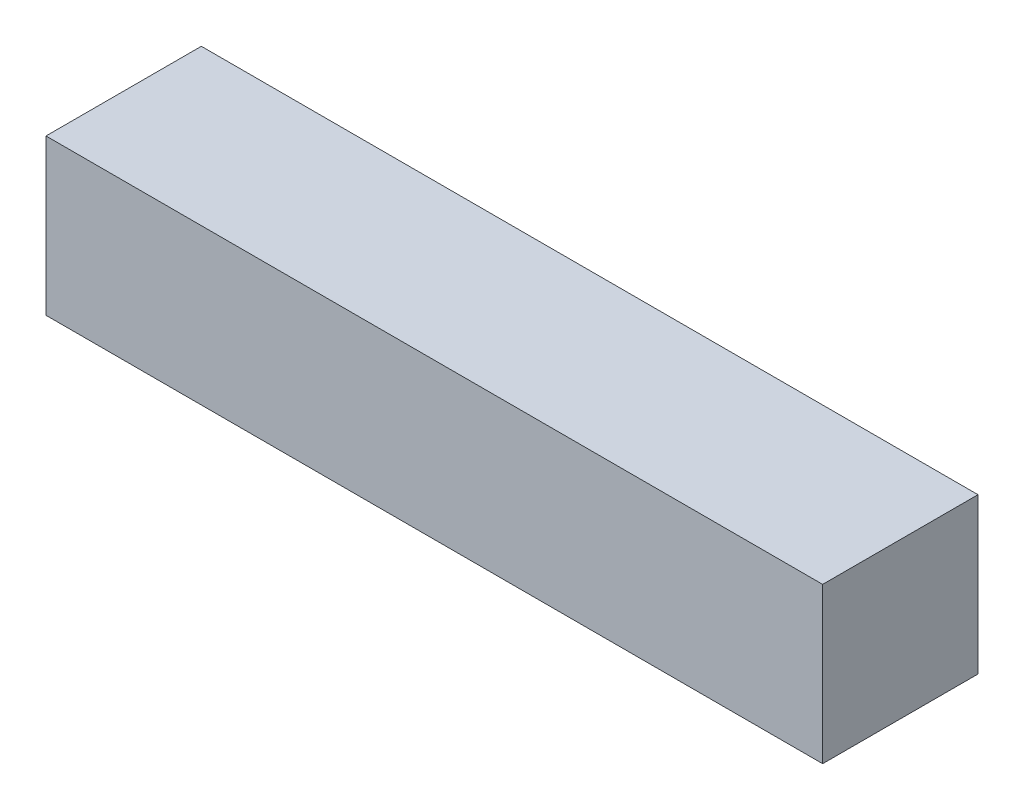
ISO-10303-21;
HEADER;
FILE_DESCRIPTION(('STEP AP214'),'2;1');
FILE_NAME('part.step','',(''),(''),'','','');
FILE_SCHEMA(('AUTOMOTIVE_DESIGN { 1 0 10303 214 1 1 1 1 }'));
ENDSEC;
DATA;
#1=APPLICATION_CONTEXT('core data for automotive mechanical design processes');
#2=APPLICATION_PROTOCOL_DEFINITION('international standard','automotive_design',2000,#1);
#3=PRODUCT_CONTEXT('',#1,'mechanical');
#4=PRODUCT('Part','Part','',(#3));
#5=PRODUCT_RELATED_PRODUCT_CATEGORY('part','',(#4));
#6=PRODUCT_DEFINITION_FORMATION('','',#4);
#7=PRODUCT_DEFINITION_CONTEXT('part definition',#1,'design');
#8=PRODUCT_DEFINITION('design','',#6,#7);
#9=PRODUCT_DEFINITION_SHAPE('','',#8);
#10=(LENGTH_UNIT() NAMED_UNIT(*) SI_UNIT(.MILLI.,.METRE.));
#11=(NAMED_UNIT(*) PLANE_ANGLE_UNIT() SI_UNIT($,.RADIAN.));
#12=(NAMED_UNIT(*) SI_UNIT($,.STERADIAN.) SOLID_ANGLE_UNIT());
#13=UNCERTAINTY_MEASURE_WITH_UNIT(LENGTH_MEASURE(1.E-05),#10,'distance_accuracy_value','');
#14=(GEOMETRIC_REPRESENTATION_CONTEXT(3) GLOBAL_UNCERTAINTY_ASSIGNED_CONTEXT((#13)) GLOBAL_UNIT_ASSIGNED_CONTEXT((#10,
#11,#12)) REPRESENTATION_CONTEXT('',''));
#15=CARTESIAN_POINT('',(0.,0.,0.));
#16=DIRECTION('',(0.,0.,1.));
#17=DIRECTION('',(1.,0.,0.));
#18=AXIS2_PLACEMENT_3D('',#15,#16,#17);
#19=CARTESIAN_POINT('',(-18.0731707317074,-6.,6.));
#20=DIRECTION('',(0.,1.,0.));
#21=DIRECTION('',(-1.,0.,0.));
#22=AXIS2_PLACEMENT_3D('',#19,#20,#21);
#23=PLANE('',#22);
#24=DIRECTION('',(1.,0.,0.));
#25=VECTOR('',#24,1.);
#26=CARTESIAN_POINT('',(-18.0731707317074,-6.,0.));
#27=LINE('',#26,#25);
#28=CARTESIAN_POINT('',(-18.0731707317074,-6.,0.));
#29=VERTEX_POINT('',#28);
#30=CARTESIAN_POINT('',(11.9268292682926,-6.,0.));
#31=VERTEX_POINT('',#30);
#32=EDGE_CURVE('E104',#29,#31,#27,.T.);
#33=ORIENTED_EDGE('',*,*,#32,.T.);
#34=DIRECTION('',(0.,0.,-1.));
#35=VECTOR('',#34,1.);
#36=CARTESIAN_POINT('',(11.9268292682926,-6.,6.));
#37=LINE('',#36,#35);
#38=CARTESIAN_POINT('',(11.9268292682926,-6.,6.));
#39=VERTEX_POINT('',#38);
#40=EDGE_CURVE('E11',#39,#31,#37,.T.);
#41=ORIENTED_EDGE('',*,*,#40,.F.);
#42=DIRECTION('',(1.,0.,0.));
#43=VECTOR('',#42,1.);
#44=CARTESIAN_POINT('',(-18.0731707317074,-6.,6.));
#45=LINE('',#44,#43);
#46=CARTESIAN_POINT('',(-18.0731707317074,-6.,6.));
#47=VERTEX_POINT('',#46);
#48=EDGE_CURVE('E92',#47,#39,#45,.T.);
#49=ORIENTED_EDGE('',*,*,#48,.F.);
#50=DIRECTION('',(0.,0.,-1.));
#51=VECTOR('',#50,1.);
#52=CARTESIAN_POINT('',(-18.0731707317074,-6.,6.));
#53=LINE('',#52,#51);
#54=EDGE_CURVE('E100',#47,#29,#53,.T.);
#55=ORIENTED_EDGE('',*,*,#54,.T.);
#56=EDGE_LOOP('',(#33,#41,#49,#55));
#57=FACE_BOUND('',#56,.T.);
#58=ADVANCED_FACE('F41',(#57),#23,.F.);
#59=CARTESIAN_POINT('',(11.9268292682926,-6.,6.));
#60=DIRECTION('',(-1.,0.,0.));
#61=DIRECTION('',(0.,0.,1.));
#62=AXIS2_PLACEMENT_3D('',#59,#60,#61);
#63=PLANE('',#62);
#64=DIRECTION('',(0.,1.,0.));
#65=VECTOR('',#64,1.);
#66=CARTESIAN_POINT('',(11.9268292682926,-6.,0.));
#67=LINE('',#66,#65);
#68=CARTESIAN_POINT('',(11.9268292682926,0.,0.));
#69=VERTEX_POINT('',#68);
#70=EDGE_CURVE('E96',#31,#69,#67,.T.);
#71=ORIENTED_EDGE('',*,*,#70,.T.);
#72=DIRECTION('',(0.,0.,-1.));
#73=VECTOR('',#72,1.);
#74=CARTESIAN_POINT('',(11.9268292682926,0.,6.));
#75=LINE('',#74,#73);
#76=CARTESIAN_POINT('',(11.9268292682926,0.,6.));
#77=VERTEX_POINT('',#76);
#78=EDGE_CURVE('E49',#77,#69,#75,.T.);
#79=ORIENTED_EDGE('',*,*,#78,.F.);
#80=DIRECTION('',(0.,1.,0.));
#81=VECTOR('',#80,1.);
#82=CARTESIAN_POINT('',(11.9268292682926,-6.,6.));
#83=LINE('',#82,#81);
#84=EDGE_CURVE('E87',#39,#77,#83,.T.);
#85=ORIENTED_EDGE('',*,*,#84,.F.);
#86=ORIENTED_EDGE('',*,*,#40,.T.);
#87=EDGE_LOOP('',(#71,#79,#85,#86));
#88=FACE_BOUND('',#87,.T.);
#89=ADVANCED_FACE('F95',(#88),#63,.F.);
#90=CARTESIAN_POINT('',(-18.0731707317074,0.,6.));
#91=DIRECTION('',(0.,-1.,0.));
#92=DIRECTION('',(1.,0.,0.));
#93=AXIS2_PLACEMENT_3D('',#90,#91,#92);
#94=PLANE('',#93);
#95=DIRECTION('',(-1.,0.,0.));
#96=VECTOR('',#95,1.);
#97=CARTESIAN_POINT('',(-18.0731707317074,0.,0.));
#98=LINE('',#97,#96);
#99=CARTESIAN_POINT('',(-18.0731707317074,0.,0.));
#100=VERTEX_POINT('',#99);
#101=EDGE_CURVE('E74',#69,#100,#98,.T.);
#102=ORIENTED_EDGE('',*,*,#101,.T.);
#103=DIRECTION('',(0.,0.,-1.));
#104=VECTOR('',#103,1.);
#105=CARTESIAN_POINT('',(-18.0731707317074,0.,6.));
#106=LINE('',#105,#104);
#107=CARTESIAN_POINT('',(-18.0731707317074,0.,6.));
#108=VERTEX_POINT('',#107);
#109=EDGE_CURVE('E97',#108,#100,#106,.T.);
#110=ORIENTED_EDGE('',*,*,#109,.F.);
#111=DIRECTION('',(-1.,0.,0.));
#112=VECTOR('',#111,1.);
#113=CARTESIAN_POINT('',(-18.0731707317074,0.,6.));
#114=LINE('',#113,#112);
#115=EDGE_CURVE('E90',#77,#108,#114,.T.);
#116=ORIENTED_EDGE('',*,*,#115,.F.);
#117=ORIENTED_EDGE('',*,*,#78,.T.);
#118=EDGE_LOOP('',(#102,#110,#116,#117));
#119=FACE_BOUND('',#118,.T.);
#120=ADVANCED_FACE('F98',(#119),#94,.F.);
#121=CARTESIAN_POINT('',(-18.0731707317074,-6.,6.));
#122=DIRECTION('',(1.,0.,0.));
#123=DIRECTION('',(0.,0.,-1.));
#124=AXIS2_PLACEMENT_3D('',#121,#122,#123);
#125=PLANE('',#124);
#126=DIRECTION('',(0.,-1.,0.));
#127=VECTOR('',#126,1.);
#128=CARTESIAN_POINT('',(-18.0731707317074,-6.,0.));
#129=LINE('',#128,#127);
#130=EDGE_CURVE('E80',#100,#29,#129,.T.);
#131=ORIENTED_EDGE('',*,*,#130,.T.);
#132=ORIENTED_EDGE('',*,*,#54,.F.);
#133=DIRECTION('',(0.,-1.,0.));
#134=VECTOR('',#133,1.);
#135=CARTESIAN_POINT('',(-18.0731707317074,-6.,6.));
#136=LINE('',#135,#134);
#137=EDGE_CURVE('E57',#108,#47,#136,.T.);
#138=ORIENTED_EDGE('',*,*,#137,.F.);
#139=ORIENTED_EDGE('',*,*,#109,.T.);
#140=EDGE_LOOP('',(#131,#132,#138,#139));
#141=FACE_BOUND('',#140,.T.);
#142=ADVANCED_FACE('F111',(#141),#125,.F.);
#143=CARTESIAN_POINT('',(0.,0.,6.));
#144=DIRECTION('',(0.,0.,1.));
#145=DIRECTION('',(1.,0.,0.));
#146=AXIS2_PLACEMENT_3D('',#143,#144,#145);
#147=PLANE('',#146);
#148=ORIENTED_EDGE('',*,*,#48,.T.);
#149=ORIENTED_EDGE('',*,*,#84,.T.);
#150=ORIENTED_EDGE('',*,*,#115,.T.);
#151=ORIENTED_EDGE('',*,*,#137,.T.);
#152=EDGE_LOOP('',(#148,#149,#150,#151));
#153=FACE_BOUND('',#152,.T.);
#154=ADVANCED_FACE('F88',(#153),#147,.T.);
#155=CARTESIAN_POINT('',(0.,0.,0.));
#156=DIRECTION('',(0.,0.,1.));
#157=DIRECTION('',(1.,0.,0.));
#158=AXIS2_PLACEMENT_3D('',#155,#156,#157);
#159=PLANE('',#158);
#160=ORIENTED_EDGE('',*,*,#32,.F.);
#161=ORIENTED_EDGE('',*,*,#130,.F.);
#162=ORIENTED_EDGE('',*,*,#101,.F.);
#163=ORIENTED_EDGE('',*,*,#70,.F.);
#164=EDGE_LOOP('',(#160,#161,#162,#163));
#165=FACE_BOUND('',#164,.T.);
#166=ADVANCED_FACE('F114',(#165),#159,.F.);
#167=CLOSED_SHELL('',(#58,#89,#120,#142,#154,#166));
#168=MANIFOLD_SOLID_BREP('B2',#167);
#169=ADVANCED_BREP_SHAPE_REPRESENTATION('',(#18,#168),#14);
#170=SHAPE_DEFINITION_REPRESENTATION(#9,#169);
ENDSEC;
END-ISO-10303-21;
